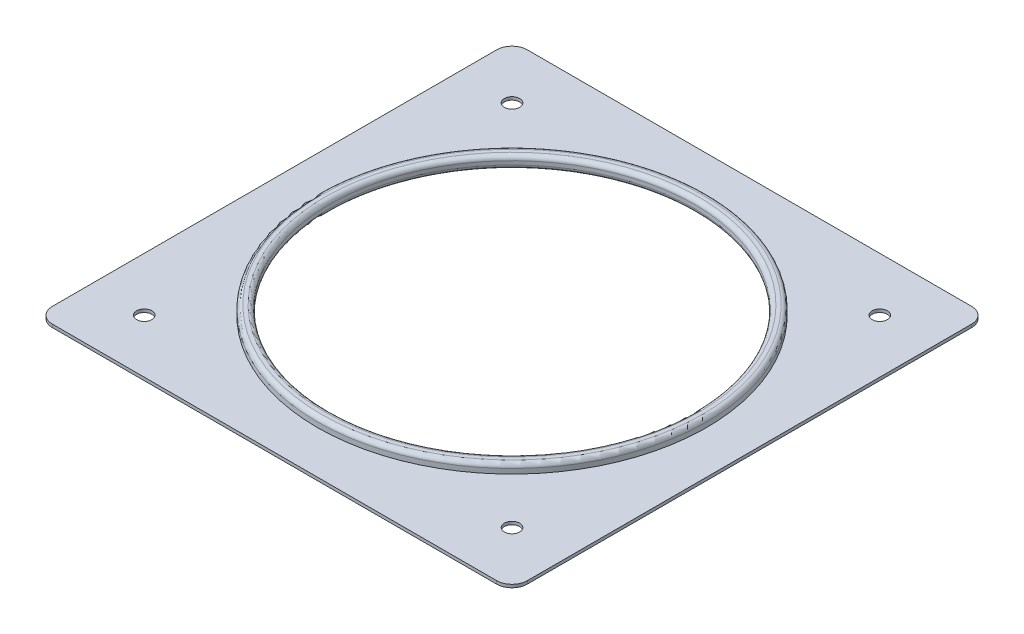
ISO-10303-21;
HEADER;
FILE_DESCRIPTION(('STEP AP214'),'2;1');
FILE_NAME('part.step','',(''),(''),'','','');
FILE_SCHEMA(('AUTOMOTIVE_DESIGN { 1 0 10303 214 1 1 1 1 }'));
ENDSEC;
DATA;
#1=APPLICATION_CONTEXT('core data for automotive mechanical design processes');
#2=APPLICATION_PROTOCOL_DEFINITION('international standard','automotive_design',2000,#1);
#3=PRODUCT_CONTEXT('',#1,'mechanical');
#4=PRODUCT('Part','Part','',(#3));
#5=PRODUCT_RELATED_PRODUCT_CATEGORY('part','',(#4));
#6=PRODUCT_DEFINITION_FORMATION('','',#4);
#7=PRODUCT_DEFINITION_CONTEXT('part definition',#1,'design');
#8=PRODUCT_DEFINITION('design','',#6,#7);
#9=PRODUCT_DEFINITION_SHAPE('','',#8);
#10=(LENGTH_UNIT() NAMED_UNIT(*) SI_UNIT(.MILLI.,.METRE.));
#11=(NAMED_UNIT(*) PLANE_ANGLE_UNIT() SI_UNIT($,.RADIAN.));
#12=(NAMED_UNIT(*) SI_UNIT($,.STERADIAN.) SOLID_ANGLE_UNIT());
#13=UNCERTAINTY_MEASURE_WITH_UNIT(LENGTH_MEASURE(1.E-05),#10,'distance_accuracy_value','');
#14=(GEOMETRIC_REPRESENTATION_CONTEXT(3) GLOBAL_UNCERTAINTY_ASSIGNED_CONTEXT((#13)) GLOBAL_UNIT_ASSIGNED_CONTEXT((#10,
#11,#12)) REPRESENTATION_CONTEXT('',''));
#15=CARTESIAN_POINT('',(0.,0.,0.));
#16=DIRECTION('',(0.,0.,1.));
#17=DIRECTION('',(1.,0.,0.));
#18=AXIS2_PLACEMENT_3D('',#15,#16,#17);
#19=CARTESIAN_POINT('',(-72.5,1.,72.5));
#20=DIRECTION('',(0.,1.,0.));
#21=DIRECTION('',(0.,0.,1.));
#22=AXIS2_PLACEMENT_3D('',#19,#20,#21);
#23=PLANE('',#22);
#24=CARTESIAN_POINT('',(-59.9999999999966,1.,60.));
#25=DIRECTION('',(0.,1.,0.));
#26=DIRECTION('',(0.,0.,1.));
#27=AXIS2_PLACEMENT_3D('',#24,#25,#26);
#28=CIRCLE('',#27,2.50000000000182);
#29=CARTESIAN_POINT('',(-59.9999999999966,1.,62.5000000000019));
#30=VERTEX_POINT('',#29);
#31=EDGE_CURVE('E414',#30,#30,#28,.T.);
#32=ORIENTED_EDGE('',*,*,#31,.F.);
#33=EDGE_LOOP('',(#32));
#34=FACE_BOUND('',#33,.T.);
#35=CARTESIAN_POINT('',(60.,1.,-60.0000000000034));
#36=DIRECTION('',(0.,1.,0.));
#37=DIRECTION('',(0.,0.,1.));
#38=AXIS2_PLACEMENT_3D('',#35,#36,#37);
#39=CIRCLE('',#38,2.5000000000035);
#40=CARTESIAN_POINT('',(60.,1.,-57.4999999999999));
#41=VERTEX_POINT('',#40);
#42=EDGE_CURVE('E437',#41,#41,#39,.T.);
#43=ORIENTED_EDGE('',*,*,#42,.F.);
#44=EDGE_LOOP('',(#43));
#45=FACE_BOUND('',#44,.T.);
#46=CARTESIAN_POINT('',(-72.5,1.,72.5));
#47=DIRECTION('',(0.,1.,0.));
#48=DIRECTION('',(0.,0.,1.));
#49=AXIS2_PLACEMENT_3D('',#46,#47,#48);
#50=CIRCLE('',#49,5.);
#51=CARTESIAN_POINT('',(-77.5,1.,72.5));
#52=VERTEX_POINT('',#51);
#53=CARTESIAN_POINT('',(-72.5,1.,77.5));
#54=VERTEX_POINT('',#53);
#55=EDGE_CURVE('E165',#52,#54,#50,.T.);
#56=ORIENTED_EDGE('',*,*,#55,.T.);
#57=DIRECTION('',(1.,0.,0.));
#58=VECTOR('',#57,1.);
#59=CARTESIAN_POINT('',(-72.5,1.,77.5));
#60=LINE('',#59,#58);
#61=CARTESIAN_POINT('',(72.5,1.,77.5));
#62=VERTEX_POINT('',#61);
#63=EDGE_CURVE('E101',#54,#62,#60,.T.);
#64=ORIENTED_EDGE('',*,*,#63,.T.);
#65=CARTESIAN_POINT('',(72.5,1.,72.5));
#66=DIRECTION('',(0.,1.,0.));
#67=DIRECTION('',(0.,0.,1.));
#68=AXIS2_PLACEMENT_3D('',#65,#66,#67);
#69=CIRCLE('',#68,5.);
#70=CARTESIAN_POINT('',(77.5,1.,72.5));
#71=VERTEX_POINT('',#70);
#72=EDGE_CURVE('E454',#62,#71,#69,.T.);
#73=ORIENTED_EDGE('',*,*,#72,.T.);
#74=DIRECTION('',(0.,0.,-1.));
#75=VECTOR('',#74,1.);
#76=CARTESIAN_POINT('',(77.5,1.,72.5));
#77=LINE('',#76,#75);
#78=CARTESIAN_POINT('',(77.5,1.,-72.5));
#79=VERTEX_POINT('',#78);
#80=EDGE_CURVE('E457',#71,#79,#77,.T.);
#81=ORIENTED_EDGE('',*,*,#80,.T.);
#82=CARTESIAN_POINT('',(72.5,1.,-72.5));
#83=DIRECTION('',(0.,1.,0.));
#84=DIRECTION('',(0.,0.,1.));
#85=AXIS2_PLACEMENT_3D('',#82,#83,#84);
#86=CIRCLE('',#85,5.);
#87=CARTESIAN_POINT('',(72.5,1.,-77.5));
#88=VERTEX_POINT('',#87);
#89=EDGE_CURVE('E120',#79,#88,#86,.T.);
#90=ORIENTED_EDGE('',*,*,#89,.T.);
#91=DIRECTION('',(-1.,0.,0.));
#92=VECTOR('',#91,1.);
#93=CARTESIAN_POINT('',(-72.5,1.,-77.5));
#94=LINE('',#93,#92);
#95=CARTESIAN_POINT('',(-72.5,1.,-77.5));
#96=VERTEX_POINT('',#95);
#97=EDGE_CURVE('E114',#88,#96,#94,.T.);
#98=ORIENTED_EDGE('',*,*,#97,.T.);
#99=CARTESIAN_POINT('',(-72.5,1.,-72.5));
#100=DIRECTION('',(0.,1.,0.));
#101=DIRECTION('',(0.,0.,1.));
#102=AXIS2_PLACEMENT_3D('',#99,#100,#101);
#103=CIRCLE('',#102,5.);
#104=CARTESIAN_POINT('',(-77.5,1.,-72.5));
#105=VERTEX_POINT('',#104);
#106=EDGE_CURVE('E118',#96,#105,#103,.T.);
#107=ORIENTED_EDGE('',*,*,#106,.T.);
#108=DIRECTION('',(0.,0.,1.));
#109=VECTOR('',#108,1.);
#110=CARTESIAN_POINT('',(-77.5,1.,72.5));
#111=LINE('',#110,#109);
#112=EDGE_CURVE('E57',#105,#52,#111,.T.);
#113=ORIENTED_EDGE('',*,*,#112,.T.);
#114=EDGE_LOOP('',(#56,#64,#73,#81,#90,#98,#107,#113));
#115=FACE_BOUND('',#114,.T.);
#116=CARTESIAN_POINT('',(-60.,1.,-60.));
#117=DIRECTION('',(0.,1.,0.));
#118=DIRECTION('',(0.,0.,1.));
#119=AXIS2_PLACEMENT_3D('',#116,#117,#118);
#120=CIRCLE('',#119,2.5);
#121=CARTESIAN_POINT('',(-60.,1.,-57.5));
#122=VERTEX_POINT('',#121);
#123=EDGE_CURVE('E147',#122,#122,#120,.T.);
#124=ORIENTED_EDGE('',*,*,#123,.F.);
#125=EDGE_LOOP('',(#124));
#126=FACE_BOUND('',#125,.T.);
#127=CARTESIAN_POINT('',(60.0000000000034,1.,59.9999999999966));
#128=DIRECTION('',(0.,1.,0.));
#129=DIRECTION('',(0.,0.,1.));
#130=AXIS2_PLACEMENT_3D('',#127,#128,#129);
#131=CIRCLE('',#130,2.50000000000477);
#132=CARTESIAN_POINT('',(60.0000000000034,1.,62.5000000000014));
#133=VERTEX_POINT('',#132);
#134=EDGE_CURVE('E429',#133,#133,#131,.T.);
#135=ORIENTED_EDGE('',*,*,#134,.F.);
#136=EDGE_LOOP('',(#135));
#137=FACE_BOUND('',#136,.T.);
#138=CARTESIAN_POINT('',(0.,1.,0.));
#139=DIRECTION('',(0.,1.,0.));
#140=DIRECTION('',(0.,0.,1.));
#141=AXIS2_PLACEMENT_3D('',#138,#139,#140);
#142=CIRCLE('',#141,63.5);
#143=CARTESIAN_POINT('',(0.,1.,63.5));
#144=VERTEX_POINT('',#143);
#145=EDGE_CURVE('E420',#144,#144,#142,.T.);
#146=ORIENTED_EDGE('',*,*,#145,.F.);
#147=EDGE_LOOP('',(#146));
#148=FACE_BOUND('',#147,.T.);
#149=ADVANCED_FACE('F39',(#34,#45,#115,#126,#137,#148),#23,.T.);
#150=CARTESIAN_POINT('',(-72.5,0.,72.5));
#151=DIRECTION('',(0.,1.,0.));
#152=DIRECTION('',(0.,0.,1.));
#153=AXIS2_PLACEMENT_3D('',#150,#151,#152);
#154=PLANE('',#153);
#155=CARTESIAN_POINT('',(0.,0.,0.));
#156=DIRECTION('',(0.,1.,0.));
#157=DIRECTION('',(0.,0.,1.));
#158=AXIS2_PLACEMENT_3D('',#155,#156,#157);
#159=CIRCLE('',#158,60.9);
#160=CARTESIAN_POINT('',(0.,0.,60.9));
#161=VERTEX_POINT('',#160);
#162=EDGE_CURVE('E49',#161,#161,#159,.T.);
#163=ORIENTED_EDGE('',*,*,#162,.T.);
#164=EDGE_LOOP('',(#163));
#165=FACE_BOUND('',#164,.T.);
#166=CARTESIAN_POINT('',(-72.5,0.,72.5));
#167=DIRECTION('',(0.,1.,0.));
#168=DIRECTION('',(0.,0.,1.));
#169=AXIS2_PLACEMENT_3D('',#166,#167,#168);
#170=CIRCLE('',#169,5.);
#171=CARTESIAN_POINT('',(-77.5,0.,72.5));
#172=VERTEX_POINT('',#171);
#173=CARTESIAN_POINT('',(-72.5,0.,77.5));
#174=VERTEX_POINT('',#173);
#175=EDGE_CURVE('E142',#172,#174,#170,.T.);
#176=ORIENTED_EDGE('',*,*,#175,.F.);
#177=DIRECTION('',(0.,0.,1.));
#178=VECTOR('',#177,1.);
#179=CARTESIAN_POINT('',(-77.5,0.,72.5));
#180=LINE('',#179,#178);
#181=CARTESIAN_POINT('',(-77.5,0.,-72.5));
#182=VERTEX_POINT('',#181);
#183=EDGE_CURVE('E92',#182,#172,#180,.T.);
#184=ORIENTED_EDGE('',*,*,#183,.F.);
#185=CARTESIAN_POINT('',(-72.5,0.,-72.5));
#186=DIRECTION('',(0.,1.,0.));
#187=DIRECTION('',(0.,0.,1.));
#188=AXIS2_PLACEMENT_3D('',#185,#186,#187);
#189=CIRCLE('',#188,5.);
#190=CARTESIAN_POINT('',(-72.5,0.,-77.5));
#191=VERTEX_POINT('',#190);
#192=EDGE_CURVE('E86',#191,#182,#189,.T.);
#193=ORIENTED_EDGE('',*,*,#192,.F.);
#194=DIRECTION('',(-1.,0.,0.));
#195=VECTOR('',#194,1.);
#196=CARTESIAN_POINT('',(-72.5,0.,-77.5));
#197=LINE('',#196,#195);
#198=CARTESIAN_POINT('',(72.5,0.,-77.5));
#199=VERTEX_POINT('',#198);
#200=EDGE_CURVE('E129',#199,#191,#197,.T.);
#201=ORIENTED_EDGE('',*,*,#200,.F.);
#202=CARTESIAN_POINT('',(72.5,0.,-72.5));
#203=DIRECTION('',(0.,1.,0.));
#204=DIRECTION('',(0.,0.,1.));
#205=AXIS2_PLACEMENT_3D('',#202,#203,#204);
#206=CIRCLE('',#205,5.);
#207=CARTESIAN_POINT('',(77.5,0.,-72.5));
#208=VERTEX_POINT('',#207);
#209=EDGE_CURVE('E156',#208,#199,#206,.T.);
#210=ORIENTED_EDGE('',*,*,#209,.F.);
#211=DIRECTION('',(0.,0.,-1.));
#212=VECTOR('',#211,1.);
#213=CARTESIAN_POINT('',(77.5,0.,72.5));
#214=LINE('',#213,#212);
#215=CARTESIAN_POINT('',(77.5,0.,72.5));
#216=VERTEX_POINT('',#215);
#217=EDGE_CURVE('E153',#216,#208,#214,.T.);
#218=ORIENTED_EDGE('',*,*,#217,.F.);
#219=CARTESIAN_POINT('',(72.5,0.,72.5));
#220=DIRECTION('',(0.,1.,0.));
#221=DIRECTION('',(0.,0.,1.));
#222=AXIS2_PLACEMENT_3D('',#219,#220,#221);
#223=CIRCLE('',#222,5.);
#224=CARTESIAN_POINT('',(72.5,0.,77.5));
#225=VERTEX_POINT('',#224);
#226=EDGE_CURVE('E150',#225,#216,#223,.T.);
#227=ORIENTED_EDGE('',*,*,#226,.F.);
#228=DIRECTION('',(1.,0.,0.));
#229=VECTOR('',#228,1.);
#230=CARTESIAN_POINT('',(-72.5,0.,77.5));
#231=LINE('',#230,#229);
#232=EDGE_CURVE('E146',#174,#225,#231,.T.);
#233=ORIENTED_EDGE('',*,*,#232,.F.);
#234=EDGE_LOOP('',(#176,#184,#193,#201,#210,#218,#227,#233));
#235=FACE_BOUND('',#234,.T.);
#236=CARTESIAN_POINT('',(-60.,0.,-60.));
#237=DIRECTION('',(0.,1.,0.));
#238=DIRECTION('',(0.,0.,1.));
#239=AXIS2_PLACEMENT_3D('',#236,#237,#238);
#240=CIRCLE('',#239,2.5);
#241=CARTESIAN_POINT('',(-60.,0.,-57.5));
#242=VERTEX_POINT('',#241);
#243=EDGE_CURVE('E441',#242,#242,#240,.T.);
#244=ORIENTED_EDGE('',*,*,#243,.T.);
#245=EDGE_LOOP('',(#244));
#246=FACE_BOUND('',#245,.T.);
#247=CARTESIAN_POINT('',(60.,0.,-60.0000000000034));
#248=DIRECTION('',(0.,1.,0.));
#249=DIRECTION('',(0.,0.,1.));
#250=AXIS2_PLACEMENT_3D('',#247,#248,#249);
#251=CIRCLE('',#250,2.5000000000035);
#252=CARTESIAN_POINT('',(60.,0.,-57.4999999999999));
#253=VERTEX_POINT('',#252);
#254=EDGE_CURVE('E433',#253,#253,#251,.T.);
#255=ORIENTED_EDGE('',*,*,#254,.T.);
#256=EDGE_LOOP('',(#255));
#257=FACE_BOUND('',#256,.T.);
#258=CARTESIAN_POINT('',(60.0000000000034,0.,59.9999999999966));
#259=DIRECTION('',(0.,1.,0.));
#260=DIRECTION('',(0.,0.,1.));
#261=AXIS2_PLACEMENT_3D('',#258,#259,#260);
#262=CIRCLE('',#261,2.50000000000477);
#263=CARTESIAN_POINT('',(60.0000000000034,0.,62.5000000000014));
#264=VERTEX_POINT('',#263);
#265=EDGE_CURVE('E424',#264,#264,#262,.T.);
#266=ORIENTED_EDGE('',*,*,#265,.T.);
#267=EDGE_LOOP('',(#266));
#268=FACE_BOUND('',#267,.T.);
#269=CARTESIAN_POINT('',(-59.9999999999966,0.,60.));
#270=DIRECTION('',(0.,1.,0.));
#271=DIRECTION('',(0.,0.,1.));
#272=AXIS2_PLACEMENT_3D('',#269,#270,#271);
#273=CIRCLE('',#272,2.50000000000182);
#274=CARTESIAN_POINT('',(-59.9999999999966,0.,62.5000000000019));
#275=VERTEX_POINT('',#274);
#276=EDGE_CURVE('E417',#275,#275,#273,.T.);
#277=ORIENTED_EDGE('',*,*,#276,.T.);
#278=EDGE_LOOP('',(#277));
#279=FACE_BOUND('',#278,.T.);
#280=ADVANCED_FACE('F206',(#165,#235,#246,#257,#268,#279),#154,.F.);
#281=CARTESIAN_POINT('',(-72.5,1.,72.5));
#282=DIRECTION('',(0.,-1.,0.));
#283=DIRECTION('',(0.,0.,-1.));
#284=AXIS2_PLACEMENT_3D('',#281,#282,#283);
#285=CYLINDRICAL_SURFACE('',#284,5.);
#286=ORIENTED_EDGE('',*,*,#175,.T.);
#287=DIRECTION('',(0.,-1.,0.));
#288=VECTOR('',#287,1.);
#289=CARTESIAN_POINT('',(-72.5,1.,77.5));
#290=LINE('',#289,#288);
#291=EDGE_CURVE('E184',#54,#174,#290,.T.);
#292=ORIENTED_EDGE('',*,*,#291,.F.);
#293=ORIENTED_EDGE('',*,*,#55,.F.);
#294=DIRECTION('',(0.,-1.,0.));
#295=VECTOR('',#294,1.);
#296=CARTESIAN_POINT('',(-77.5,1.,72.5));
#297=LINE('',#296,#295);
#298=EDGE_CURVE('E138',#52,#172,#297,.T.);
#299=ORIENTED_EDGE('',*,*,#298,.T.);
#300=EDGE_LOOP('',(#286,#292,#293,#299));
#301=FACE_BOUND('',#300,.T.);
#302=ADVANCED_FACE('F224',(#301),#285,.T.);
#303=CARTESIAN_POINT('',(-72.5,1.,77.5));
#304=DIRECTION('',(0.,0.,-1.));
#305=DIRECTION('',(-1.,0.,0.));
#306=AXIS2_PLACEMENT_3D('',#303,#304,#305);
#307=PLANE('',#306);
#308=ORIENTED_EDGE('',*,*,#232,.T.);
#309=DIRECTION('',(0.,-1.,0.));
#310=VECTOR('',#309,1.);
#311=CARTESIAN_POINT('',(72.5,1.,77.5));
#312=LINE('',#311,#310);
#313=EDGE_CURVE('E180',#62,#225,#312,.T.);
#314=ORIENTED_EDGE('',*,*,#313,.F.);
#315=ORIENTED_EDGE('',*,*,#63,.F.);
#316=ORIENTED_EDGE('',*,*,#291,.T.);
#317=EDGE_LOOP('',(#308,#314,#315,#316));
#318=FACE_BOUND('',#317,.T.);
#319=ADVANCED_FACE('F250',(#318),#307,.F.);
#320=CARTESIAN_POINT('',(72.5,1.,72.5));
#321=DIRECTION('',(0.,-1.,0.));
#322=DIRECTION('',(0.,0.,-1.));
#323=AXIS2_PLACEMENT_3D('',#320,#321,#322);
#324=CYLINDRICAL_SURFACE('',#323,5.);
#325=ORIENTED_EDGE('',*,*,#226,.T.);
#326=DIRECTION('',(0.,-1.,0.));
#327=VECTOR('',#326,1.);
#328=CARTESIAN_POINT('',(77.5,1.,72.5));
#329=LINE('',#328,#327);
#330=EDGE_CURVE('E176',#71,#216,#329,.T.);
#331=ORIENTED_EDGE('',*,*,#330,.F.);
#332=ORIENTED_EDGE('',*,*,#72,.F.);
#333=ORIENTED_EDGE('',*,*,#313,.T.);
#334=EDGE_LOOP('',(#325,#331,#332,#333));
#335=FACE_BOUND('',#334,.T.);
#336=ADVANCED_FACE('F246',(#335),#324,.T.);
#337=CARTESIAN_POINT('',(77.5,1.,72.5));
#338=DIRECTION('',(-1.,0.,0.));
#339=DIRECTION('',(0.,0.,1.));
#340=AXIS2_PLACEMENT_3D('',#337,#338,#339);
#341=PLANE('',#340);
#342=ORIENTED_EDGE('',*,*,#217,.T.);
#343=DIRECTION('',(0.,-1.,0.));
#344=VECTOR('',#343,1.);
#345=CARTESIAN_POINT('',(77.5,1.,-72.5));
#346=LINE('',#345,#344);
#347=EDGE_CURVE('E172',#79,#208,#346,.T.);
#348=ORIENTED_EDGE('',*,*,#347,.F.);
#349=ORIENTED_EDGE('',*,*,#80,.F.);
#350=ORIENTED_EDGE('',*,*,#330,.T.);
#351=EDGE_LOOP('',(#342,#348,#349,#350));
#352=FACE_BOUND('',#351,.T.);
#353=ADVANCED_FACE('F242',(#352),#341,.F.);
#354=CARTESIAN_POINT('',(72.5,1.,-72.5));
#355=DIRECTION('',(0.,-1.,0.));
#356=DIRECTION('',(0.,0.,-1.));
#357=AXIS2_PLACEMENT_3D('',#354,#355,#356);
#358=CYLINDRICAL_SURFACE('',#357,5.);
#359=ORIENTED_EDGE('',*,*,#209,.T.);
#360=DIRECTION('',(0.,-1.,0.));
#361=VECTOR('',#360,1.);
#362=CARTESIAN_POINT('',(72.5,1.,-77.5));
#363=LINE('',#362,#361);
#364=EDGE_CURVE('E131',#88,#199,#363,.T.);
#365=ORIENTED_EDGE('',*,*,#364,.F.);
#366=ORIENTED_EDGE('',*,*,#89,.F.);
#367=ORIENTED_EDGE('',*,*,#347,.T.);
#368=EDGE_LOOP('',(#359,#365,#366,#367));
#369=FACE_BOUND('',#368,.T.);
#370=ADVANCED_FACE('F239',(#369),#358,.T.);
#371=CARTESIAN_POINT('',(-72.5,1.,-77.5));
#372=DIRECTION('',(0.,0.,1.));
#373=DIRECTION('',(1.,0.,0.));
#374=AXIS2_PLACEMENT_3D('',#371,#372,#373);
#375=PLANE('',#374);
#376=ORIENTED_EDGE('',*,*,#200,.T.);
#377=DIRECTION('',(0.,-1.,0.));
#378=VECTOR('',#377,1.);
#379=CARTESIAN_POINT('',(-72.5,1.,-77.5));
#380=LINE('',#379,#378);
#381=EDGE_CURVE('E126',#96,#191,#380,.T.);
#382=ORIENTED_EDGE('',*,*,#381,.F.);
#383=ORIENTED_EDGE('',*,*,#97,.F.);
#384=ORIENTED_EDGE('',*,*,#364,.T.);
#385=EDGE_LOOP('',(#376,#382,#383,#384));
#386=FACE_BOUND('',#385,.T.);
#387=ADVANCED_FACE('F127',(#386),#375,.F.);
#388=CARTESIAN_POINT('',(-72.5,1.,-72.5));
#389=DIRECTION('',(0.,-1.,0.));
#390=DIRECTION('',(0.,0.,-1.));
#391=AXIS2_PLACEMENT_3D('',#388,#389,#390);
#392=CYLINDRICAL_SURFACE('',#391,5.);
#393=ORIENTED_EDGE('',*,*,#192,.T.);
#394=DIRECTION('',(0.,-1.,0.));
#395=VECTOR('',#394,1.);
#396=CARTESIAN_POINT('',(-77.5,1.,-72.5));
#397=LINE('',#396,#395);
#398=EDGE_CURVE('E132',#105,#182,#397,.T.);
#399=ORIENTED_EDGE('',*,*,#398,.F.);
#400=ORIENTED_EDGE('',*,*,#106,.F.);
#401=ORIENTED_EDGE('',*,*,#381,.T.);
#402=EDGE_LOOP('',(#393,#399,#400,#401));
#403=FACE_BOUND('',#402,.T.);
#404=ADVANCED_FACE('F134',(#403),#392,.T.);
#405=CARTESIAN_POINT('',(-77.5,1.,72.5));
#406=DIRECTION('',(1.,0.,0.));
#407=DIRECTION('',(0.,0.,-1.));
#408=AXIS2_PLACEMENT_3D('',#405,#406,#407);
#409=PLANE('',#408);
#410=ORIENTED_EDGE('',*,*,#183,.T.);
#411=ORIENTED_EDGE('',*,*,#298,.F.);
#412=ORIENTED_EDGE('',*,*,#112,.F.);
#413=ORIENTED_EDGE('',*,*,#398,.T.);
#414=EDGE_LOOP('',(#410,#411,#412,#413));
#415=FACE_BOUND('',#414,.T.);
#416=ADVANCED_FACE('F232',(#415),#409,.F.);
#417=CARTESIAN_POINT('',(0.,1.,0.));
#418=DIRECTION('',(0.,-1.,0.));
#419=DIRECTION('',(0.,0.,-1.));
#420=AXIS2_PLACEMENT_3D('',#417,#418,#419);
#421=CYLINDRICAL_SURFACE('',#420,59.5);
#422=CARTESIAN_POINT('',(0.,1.4,0.));
#423=DIRECTION('',(0.,1.,0.));
#424=DIRECTION('',(0.,0.,1.));
#425=AXIS2_PLACEMENT_3D('',#422,#423,#424);
#426=CIRCLE('',#425,59.5);
#427=CARTESIAN_POINT('',(0.,1.4,59.5));
#428=VERTEX_POINT('',#427);
#429=EDGE_CURVE('E11',#428,#428,#426,.F.);
#430=ORIENTED_EDGE('',*,*,#429,.T.);
#431=EDGE_LOOP('',(#430));
#432=FACE_BOUND('',#431,.T.);
#433=CARTESIAN_POINT('',(0.,2.6,0.));
#434=DIRECTION('',(0.,1.,0.));
#435=DIRECTION('',(0.,0.,1.));
#436=AXIS2_PLACEMENT_3D('',#433,#434,#435);
#437=CIRCLE('',#436,59.5);
#438=CARTESIAN_POINT('',(0.,2.6,59.5));
#439=VERTEX_POINT('',#438);
#440=EDGE_CURVE('E187',#439,#439,#437,.T.);
#441=ORIENTED_EDGE('',*,*,#440,.T.);
#442=EDGE_LOOP('',(#441));
#443=FACE_BOUND('',#442,.T.);
#444=ADVANCED_FACE('F229',(#432,#443),#421,.F.);
#445=CARTESIAN_POINT('',(-60.,1.,-60.));
#446=DIRECTION('',(0.,-1.,0.));
#447=DIRECTION('',(0.,0.,-1.));
#448=AXIS2_PLACEMENT_3D('',#445,#446,#447);
#449=CYLINDRICAL_SURFACE('',#448,2.5);
#450=ORIENTED_EDGE('',*,*,#123,.T.);
#451=EDGE_LOOP('',(#450));
#452=FACE_BOUND('',#451,.T.);
#453=ORIENTED_EDGE('',*,*,#243,.F.);
#454=EDGE_LOOP('',(#453));
#455=FACE_BOUND('',#454,.T.);
#456=ADVANCED_FACE('F271',(#452,#455),#449,.F.);
#457=CARTESIAN_POINT('',(60.,1.,-60.0000000000034));
#458=DIRECTION('',(0.,-1.,0.));
#459=DIRECTION('',(0.,0.,-1.));
#460=AXIS2_PLACEMENT_3D('',#457,#458,#459);
#461=CYLINDRICAL_SURFACE('',#460,2.5000000000035);
#462=ORIENTED_EDGE('',*,*,#42,.T.);
#463=EDGE_LOOP('',(#462));
#464=FACE_BOUND('',#463,.T.);
#465=ORIENTED_EDGE('',*,*,#254,.F.);
#466=EDGE_LOOP('',(#465));
#467=FACE_BOUND('',#466,.T.);
#468=ADVANCED_FACE('F276',(#464,#467),#461,.F.);
#469=CARTESIAN_POINT('',(60.0000000000034,1.,59.9999999999966));
#470=DIRECTION('',(0.,-1.,0.));
#471=DIRECTION('',(0.,0.,-1.));
#472=AXIS2_PLACEMENT_3D('',#469,#470,#471);
#473=CYLINDRICAL_SURFACE('',#472,2.50000000000477);
#474=ORIENTED_EDGE('',*,*,#134,.T.);
#475=EDGE_LOOP('',(#474));
#476=FACE_BOUND('',#475,.T.);
#477=ORIENTED_EDGE('',*,*,#265,.F.);
#478=EDGE_LOOP('',(#477));
#479=FACE_BOUND('',#478,.T.);
#480=ADVANCED_FACE('F281',(#476,#479),#473,.F.);
#481=CARTESIAN_POINT('',(-59.9999999999966,1.,60.));
#482=DIRECTION('',(0.,-1.,0.));
#483=DIRECTION('',(0.,0.,-1.));
#484=AXIS2_PLACEMENT_3D('',#481,#482,#483);
#485=CYLINDRICAL_SURFACE('',#484,2.50000000000182);
#486=ORIENTED_EDGE('',*,*,#31,.T.);
#487=EDGE_LOOP('',(#486));
#488=FACE_BOUND('',#487,.T.);
#489=ORIENTED_EDGE('',*,*,#276,.F.);
#490=EDGE_LOOP('',(#489));
#491=FACE_BOUND('',#490,.T.);
#492=ADVANCED_FACE('F289',(#488,#491),#485,.F.);
#493=CARTESIAN_POINT('',(0.,4.,0.));
#494=DIRECTION('',(0.,1.,0.));
#495=DIRECTION('',(0.,0.,1.));
#496=AXIS2_PLACEMENT_3D('',#493,#494,#495);
#497=PLANE('',#496);
#498=CARTESIAN_POINT('',(0.,4.,0.));
#499=DIRECTION('',(0.,1.,0.));
#500=DIRECTION('',(0.,0.,1.));
#501=AXIS2_PLACEMENT_3D('',#498,#499,#500);
#502=CIRCLE('',#501,60.9);
#503=CARTESIAN_POINT('',(0.,4.,60.9));
#504=VERTEX_POINT('',#503);
#505=EDGE_CURVE('E195',#504,#504,#502,.F.);
#506=ORIENTED_EDGE('',*,*,#505,.T.);
#507=EDGE_LOOP('',(#506));
#508=FACE_BOUND('',#507,.T.);
#509=CARTESIAN_POINT('',(0.,4.,0.));
#510=DIRECTION('',(0.,1.,0.));
#511=DIRECTION('',(0.,0.,1.));
#512=AXIS2_PLACEMENT_3D('',#509,#510,#511);
#513=CIRCLE('',#512,62.1);
#514=CARTESIAN_POINT('',(0.,4.,62.1));
#515=VERTEX_POINT('',#514);
#516=EDGE_CURVE('E191',#515,#515,#513,.T.);
#517=ORIENTED_EDGE('',*,*,#516,.T.);
#518=EDGE_LOOP('',(#517));
#519=FACE_BOUND('',#518,.T.);
#520=ADVANCED_FACE('F263',(#508,#519),#497,.T.);
#521=CARTESIAN_POINT('',(0.,4.,0.));
#522=DIRECTION('',(0.,-1.,0.));
#523=DIRECTION('',(0.,0.,-1.));
#524=AXIS2_PLACEMENT_3D('',#521,#522,#523);
#525=CYLINDRICAL_SURFACE('',#524,63.5);
#526=CARTESIAN_POINT('',(0.,2.6,0.));
#527=DIRECTION('',(0.,1.,0.));
#528=DIRECTION('',(0.,0.,1.));
#529=AXIS2_PLACEMENT_3D('',#526,#527,#528);
#530=CIRCLE('',#529,63.5);
#531=CARTESIAN_POINT('',(0.,2.6,63.5));
#532=VERTEX_POINT('',#531);
#533=EDGE_CURVE('E199',#532,#532,#530,.F.);
#534=ORIENTED_EDGE('',*,*,#533,.T.);
#535=EDGE_LOOP('',(#534));
#536=FACE_BOUND('',#535,.T.);
#537=ORIENTED_EDGE('',*,*,#145,.T.);
#538=EDGE_LOOP('',(#537));
#539=FACE_BOUND('',#538,.T.);
#540=ADVANCED_FACE('F258',(#536,#539),#525,.T.);
#541=CARTESIAN_POINT('',(0.,2.6,0.));
#542=DIRECTION('',(0.,1.,0.));
#543=DIRECTION('',(0.,0.,1.));
#544=AXIS2_PLACEMENT_3D('',#541,#542,#543);
#545=TOROIDAL_SURFACE('',#544,60.9,1.4);
#546=ORIENTED_EDGE('',*,*,#505,.F.);
#547=EDGE_LOOP('',(#546));
#548=FACE_BOUND('',#547,.T.);
#549=ORIENTED_EDGE('',*,*,#440,.F.);
#550=EDGE_LOOP('',(#549));
#551=FACE_BOUND('',#550,.T.);
#552=ADVANCED_FACE('F215',(#548,#551),#545,.T.);
#553=CARTESIAN_POINT('',(0.,2.6,0.));
#554=DIRECTION('',(0.,1.,0.));
#555=DIRECTION('',(0.,0.,1.));
#556=AXIS2_PLACEMENT_3D('',#553,#554,#555);
#557=TOROIDAL_SURFACE('',#556,62.1,1.4);
#558=ORIENTED_EDGE('',*,*,#533,.F.);
#559=EDGE_LOOP('',(#558));
#560=FACE_BOUND('',#559,.T.);
#561=ORIENTED_EDGE('',*,*,#516,.F.);
#562=EDGE_LOOP('',(#561));
#563=FACE_BOUND('',#562,.T.);
#564=ADVANCED_FACE('F210',(#560,#563),#557,.T.);
#565=CARTESIAN_POINT('',(0.,1.4,0.));
#566=DIRECTION('',(0.,1.,0.));
#567=DIRECTION('',(0.,0.,1.));
#568=AXIS2_PLACEMENT_3D('',#565,#566,#567);
#569=TOROIDAL_SURFACE('',#568,60.9,1.4);
#570=ORIENTED_EDGE('',*,*,#429,.F.);
#571=EDGE_LOOP('',(#570));
#572=FACE_BOUND('',#571,.T.);
#573=ORIENTED_EDGE('',*,*,#162,.F.);
#574=EDGE_LOOP('',(#573));
#575=FACE_BOUND('',#574,.T.);
#576=ADVANCED_FACE('F41',(#572,#575),#569,.T.);
#577=CLOSED_SHELL('',(#149,#280,#302,#319,#336,#353,#370,#387,#404,#416,#444,#456,#468,#480,
#492,#520,#540,#552,#564,#576));
#578=MANIFOLD_SOLID_BREP('B2',#577);
#579=ADVANCED_BREP_SHAPE_REPRESENTATION('',(#18,#578),#14);
#580=SHAPE_DEFINITION_REPRESENTATION(#9,#579);
ENDSEC;
END-ISO-10303-21;
